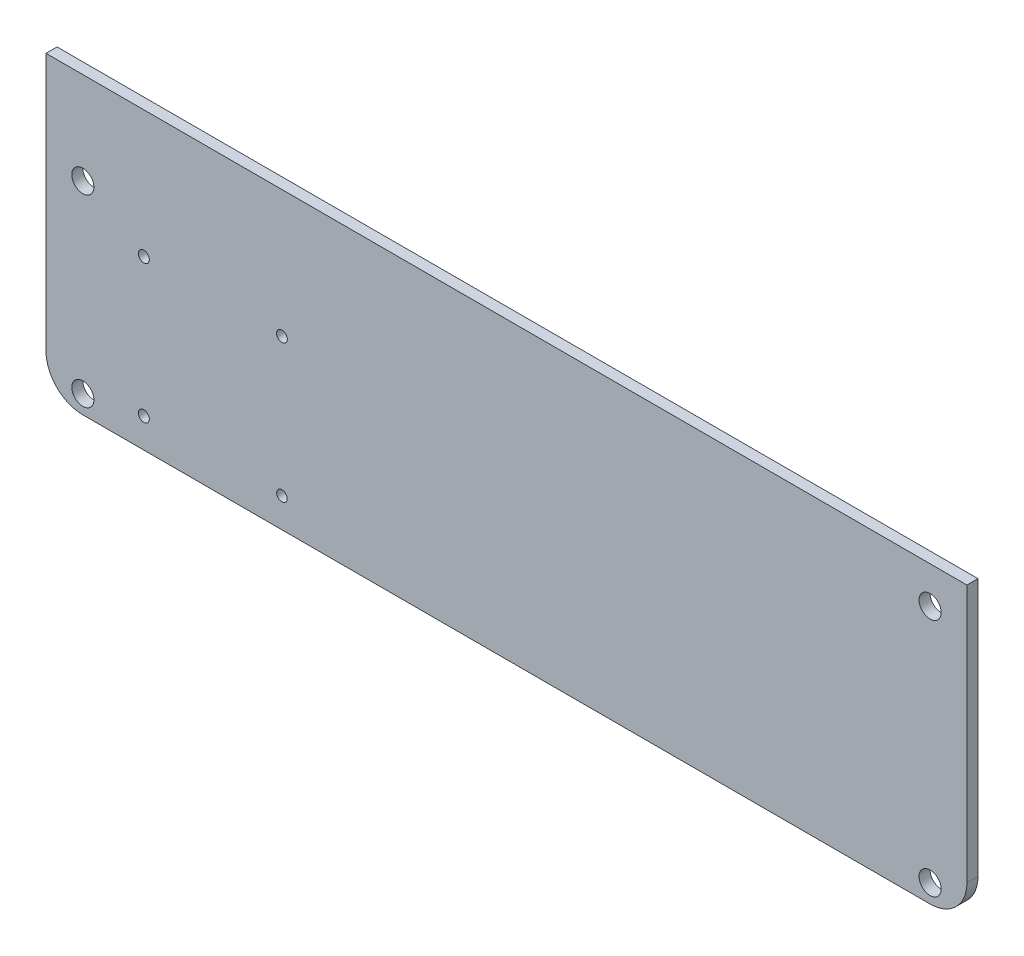
ISO-10303-21;
HEADER;
FILE_DESCRIPTION(('STEP AP214'),'2;1');
FILE_NAME('part.step','',(''),(''),'','','');
FILE_SCHEMA(('AUTOMOTIVE_DESIGN { 1 0 10303 214 1 1 1 1 }'));
ENDSEC;
DATA;
#1=APPLICATION_CONTEXT('core data for automotive mechanical design processes');
#2=APPLICATION_PROTOCOL_DEFINITION('international standard','automotive_design',2000,#1);
#3=PRODUCT_CONTEXT('',#1,'mechanical');
#4=PRODUCT('Part','Part','',(#3));
#5=PRODUCT_RELATED_PRODUCT_CATEGORY('part','',(#4));
#6=PRODUCT_DEFINITION_FORMATION('','',#4);
#7=PRODUCT_DEFINITION_CONTEXT('part definition',#1,'design');
#8=PRODUCT_DEFINITION('design','',#6,#7);
#9=PRODUCT_DEFINITION_SHAPE('','',#8);
#10=(LENGTH_UNIT() NAMED_UNIT(*) SI_UNIT(.MILLI.,.METRE.));
#11=(NAMED_UNIT(*) PLANE_ANGLE_UNIT() SI_UNIT($,.RADIAN.));
#12=(NAMED_UNIT(*) SI_UNIT($,.STERADIAN.) SOLID_ANGLE_UNIT());
#13=UNCERTAINTY_MEASURE_WITH_UNIT(LENGTH_MEASURE(1.E-05),#10,'distance_accuracy_value','');
#14=(GEOMETRIC_REPRESENTATION_CONTEXT(3) GLOBAL_UNCERTAINTY_ASSIGNED_CONTEXT((#13)) GLOBAL_UNIT_ASSIGNED_CONTEXT((#10,
#11,#12)) REPRESENTATION_CONTEXT('',''));
#15=CARTESIAN_POINT('',(0.,0.,0.));
#16=DIRECTION('',(0.,0.,1.));
#17=DIRECTION('',(1.,0.,0.));
#18=AXIS2_PLACEMENT_3D('',#15,#16,#17);
#19=CARTESIAN_POINT('',(0.,0.,3.));
#20=DIRECTION('',(1.,0.,0.));
#21=DIRECTION('',(0.,1.,0.));
#22=AXIS2_PLACEMENT_3D('',#19,#20,#21);
#23=PLANE('',#22);
#24=DIRECTION('',(0.,-1.,0.));
#25=VECTOR('',#24,1.);
#26=CARTESIAN_POINT('',(0.,0.,0.));
#27=LINE('',#26,#25);
#28=CARTESIAN_POINT('',(0.,0.,0.));
#29=VERTEX_POINT('',#28);
#30=CARTESIAN_POINT('',(0.,-69.9999999999999,0.));
#31=VERTEX_POINT('',#30);
#32=EDGE_CURVE('E119',#29,#31,#27,.T.);
#33=ORIENTED_EDGE('',*,*,#32,.T.);
#34=DIRECTION('',(0.,0.,-1.));
#35=VECTOR('',#34,1.);
#36=CARTESIAN_POINT('',(0.,-69.9999999999999,3.));
#37=LINE('',#36,#35);
#38=CARTESIAN_POINT('',(0.,-69.9999999999999,3.));
#39=VERTEX_POINT('',#38);
#40=EDGE_CURVE('E11',#39,#31,#37,.T.);
#41=ORIENTED_EDGE('',*,*,#40,.F.);
#42=DIRECTION('',(0.,-1.,0.));
#43=VECTOR('',#42,1.);
#44=CARTESIAN_POINT('',(0.,0.,3.));
#45=LINE('',#44,#43);
#46=CARTESIAN_POINT('',(0.,0.,3.));
#47=VERTEX_POINT('',#46);
#48=EDGE_CURVE('E130',#47,#39,#45,.T.);
#49=ORIENTED_EDGE('',*,*,#48,.F.);
#50=DIRECTION('',(0.,0.,-1.));
#51=VECTOR('',#50,1.);
#52=CARTESIAN_POINT('',(0.,0.,3.));
#53=LINE('',#52,#51);
#54=EDGE_CURVE('E115',#47,#29,#53,.T.);
#55=ORIENTED_EDGE('',*,*,#54,.T.);
#56=EDGE_LOOP('',(#33,#41,#49,#55));
#57=FACE_BOUND('',#56,.T.);
#58=ADVANCED_FACE('F33',(#57),#23,.F.);
#59=CARTESIAN_POINT('',(10.,-70.,3.));
#60=DIRECTION('',(0.,0.,-1.));
#61=DIRECTION('',(-1.,0.,0.));
#62=AXIS2_PLACEMENT_3D('',#59,#60,#61);
#63=CYLINDRICAL_SURFACE('',#62,10.);
#64=CARTESIAN_POINT('',(10.,-70.,0.));
#65=DIRECTION('',(0.,0.,1.));
#66=DIRECTION('',(1.,0.,0.));
#67=AXIS2_PLACEMENT_3D('',#64,#65,#66);
#68=CIRCLE('',#67,10.);
#69=CARTESIAN_POINT('',(10.0000000000001,-80.,0.));
#70=VERTEX_POINT('',#69);
#71=EDGE_CURVE('E122',#31,#70,#68,.T.);
#72=ORIENTED_EDGE('',*,*,#71,.T.);
#73=DIRECTION('',(0.,0.,-1.));
#74=VECTOR('',#73,1.);
#75=CARTESIAN_POINT('',(10.0000000000001,-80.,3.));
#76=LINE('',#75,#74);
#77=CARTESIAN_POINT('',(10.0000000000001,-80.,3.));
#78=VERTEX_POINT('',#77);
#79=EDGE_CURVE('E42',#78,#70,#76,.T.);
#80=ORIENTED_EDGE('',*,*,#79,.F.);
#81=CARTESIAN_POINT('',(10.,-70.,3.));
#82=DIRECTION('',(0.,0.,1.));
#83=DIRECTION('',(1.,0.,0.));
#84=AXIS2_PLACEMENT_3D('',#81,#82,#83);
#85=CIRCLE('',#84,10.);
#86=EDGE_CURVE('E88',#39,#78,#85,.T.);
#87=ORIENTED_EDGE('',*,*,#86,.F.);
#88=ORIENTED_EDGE('',*,*,#40,.T.);
#89=EDGE_LOOP('',(#72,#80,#87,#88));
#90=FACE_BOUND('',#89,.T.);
#91=ADVANCED_FACE('F169',(#90),#63,.T.);
#92=CARTESIAN_POINT('',(10.0000000000001,-80.,3.));
#93=DIRECTION('',(0.,1.,0.));
#94=DIRECTION('',(0.,0.,1.));
#95=AXIS2_PLACEMENT_3D('',#92,#93,#94);
#96=PLANE('',#95);
#97=DIRECTION('',(1.,0.,0.));
#98=VECTOR('',#97,1.);
#99=CARTESIAN_POINT('',(10.0000000000001,-80.,0.));
#100=LINE('',#99,#98);
#101=CARTESIAN_POINT('',(240.,-80.,0.));
#102=VERTEX_POINT('',#101);
#103=EDGE_CURVE('E125',#70,#102,#100,.T.);
#104=ORIENTED_EDGE('',*,*,#103,.T.);
#105=DIRECTION('',(0.,0.,-1.));
#106=VECTOR('',#105,1.);
#107=CARTESIAN_POINT('',(240.,-80.,3.));
#108=LINE('',#107,#106);
#109=CARTESIAN_POINT('',(240.,-80.,3.));
#110=VERTEX_POINT('',#109);
#111=EDGE_CURVE('E110',#110,#102,#108,.T.);
#112=ORIENTED_EDGE('',*,*,#111,.F.);
#113=DIRECTION('',(1.,0.,0.));
#114=VECTOR('',#113,1.);
#115=CARTESIAN_POINT('',(10.0000000000001,-80.,3.));
#116=LINE('',#115,#114);
#117=EDGE_CURVE('E101',#78,#110,#116,.T.);
#118=ORIENTED_EDGE('',*,*,#117,.F.);
#119=ORIENTED_EDGE('',*,*,#79,.T.);
#120=EDGE_LOOP('',(#104,#112,#118,#119));
#121=FACE_BOUND('',#120,.T.);
#122=ADVANCED_FACE('F172',(#121),#96,.F.);
#123=CARTESIAN_POINT('',(240.,-70.,3.));
#124=DIRECTION('',(0.,0.,-1.));
#125=DIRECTION('',(-1.,0.,0.));
#126=AXIS2_PLACEMENT_3D('',#123,#124,#125);
#127=CYLINDRICAL_SURFACE('',#126,10.);
#128=CARTESIAN_POINT('',(240.,-70.,0.));
#129=DIRECTION('',(0.,0.,1.));
#130=DIRECTION('',(-1.,0.,0.));
#131=AXIS2_PLACEMENT_3D('',#128,#129,#130);
#132=CIRCLE('',#131,10.);
#133=CARTESIAN_POINT('',(250.,-70.,0.));
#134=VERTEX_POINT('',#133);
#135=EDGE_CURVE('E109',#102,#134,#132,.T.);
#136=ORIENTED_EDGE('',*,*,#135,.T.);
#137=DIRECTION('',(0.,0.,-1.));
#138=VECTOR('',#137,1.);
#139=CARTESIAN_POINT('',(250.,-70.,3.));
#140=LINE('',#139,#138);
#141=CARTESIAN_POINT('',(250.,-70.,3.));
#142=VERTEX_POINT('',#141);
#143=EDGE_CURVE('E106',#142,#134,#140,.T.);
#144=ORIENTED_EDGE('',*,*,#143,.F.);
#145=CARTESIAN_POINT('',(240.,-70.,3.));
#146=DIRECTION('',(0.,0.,1.));
#147=DIRECTION('',(-1.,0.,0.));
#148=AXIS2_PLACEMENT_3D('',#145,#146,#147);
#149=CIRCLE('',#148,10.);
#150=EDGE_CURVE('E95',#110,#142,#149,.T.);
#151=ORIENTED_EDGE('',*,*,#150,.F.);
#152=ORIENTED_EDGE('',*,*,#111,.T.);
#153=EDGE_LOOP('',(#136,#144,#151,#152));
#154=FACE_BOUND('',#153,.T.);
#155=ADVANCED_FACE('F107',(#154),#127,.T.);
#156=CARTESIAN_POINT('',(250.,0.,3.));
#157=DIRECTION('',(-1.,0.,0.));
#158=DIRECTION('',(0.,0.,1.));
#159=AXIS2_PLACEMENT_3D('',#156,#157,#158);
#160=PLANE('',#159);
#161=DIRECTION('',(0.,1.,0.));
#162=VECTOR('',#161,1.);
#163=CARTESIAN_POINT('',(250.,0.,0.));
#164=LINE('',#163,#162);
#165=CARTESIAN_POINT('',(250.,0.,0.));
#166=VERTEX_POINT('',#165);
#167=EDGE_CURVE('E74',#134,#166,#164,.T.);
#168=ORIENTED_EDGE('',*,*,#167,.T.);
#169=DIRECTION('',(0.,0.,-1.));
#170=VECTOR('',#169,1.);
#171=CARTESIAN_POINT('',(250.,0.,3.));
#172=LINE('',#171,#170);
#173=CARTESIAN_POINT('',(250.,0.,3.));
#174=VERTEX_POINT('',#173);
#175=EDGE_CURVE('E111',#174,#166,#172,.T.);
#176=ORIENTED_EDGE('',*,*,#175,.F.);
#177=DIRECTION('',(0.,1.,0.));
#178=VECTOR('',#177,1.);
#179=CARTESIAN_POINT('',(250.,0.,3.));
#180=LINE('',#179,#178);
#181=EDGE_CURVE('E99',#142,#174,#180,.T.);
#182=ORIENTED_EDGE('',*,*,#181,.F.);
#183=ORIENTED_EDGE('',*,*,#143,.T.);
#184=EDGE_LOOP('',(#168,#176,#182,#183));
#185=FACE_BOUND('',#184,.T.);
#186=ADVANCED_FACE('F113',(#185),#160,.F.);
#187=CARTESIAN_POINT('',(0.,0.,3.));
#188=DIRECTION('',(0.,-1.,0.));
#189=DIRECTION('',(0.,0.,-1.));
#190=AXIS2_PLACEMENT_3D('',#187,#188,#189);
#191=PLANE('',#190);
#192=DIRECTION('',(-1.,0.,0.));
#193=VECTOR('',#192,1.);
#194=CARTESIAN_POINT('',(0.,0.,0.));
#195=LINE('',#194,#193);
#196=EDGE_CURVE('E80',#166,#29,#195,.T.);
#197=ORIENTED_EDGE('',*,*,#196,.T.);
#198=ORIENTED_EDGE('',*,*,#54,.F.);
#199=DIRECTION('',(-1.,0.,0.));
#200=VECTOR('',#199,1.);
#201=CARTESIAN_POINT('',(0.,0.,3.));
#202=LINE('',#201,#200);
#203=EDGE_CURVE('E51',#174,#47,#202,.T.);
#204=ORIENTED_EDGE('',*,*,#203,.F.);
#205=ORIENTED_EDGE('',*,*,#175,.T.);
#206=EDGE_LOOP('',(#197,#198,#204,#205));
#207=FACE_BOUND('',#206,.T.);
#208=ADVANCED_FACE('F177',(#207),#191,.F.);
#209=CARTESIAN_POINT('',(10.,-70.,3.));
#210=DIRECTION('',(0.,0.,1.));
#211=DIRECTION('',(1.,0.,0.));
#212=AXIS2_PLACEMENT_3D('',#209,#210,#211);
#213=PLANE('',#212);
#214=CARTESIAN_POINT('',(26.5494269665201,-72.,3.));
#215=DIRECTION('',(0.,0.,1.));
#216=DIRECTION('',(1.,0.,0.));
#217=AXIS2_PLACEMENT_3D('',#214,#215,#216);
#218=CIRCLE('',#217,1.50000000000002);
#219=CARTESIAN_POINT('',(28.0494269665201,-72.,3.));
#220=VERTEX_POINT('',#219);
#221=EDGE_CURVE('E310',#220,#220,#218,.T.);
#222=ORIENTED_EDGE('',*,*,#221,.F.);
#223=EDGE_LOOP('',(#222));
#224=FACE_BOUND('',#223,.T.);
#225=CARTESIAN_POINT('',(64.0494269665201,-72.,3.));
#226=DIRECTION('',(0.,0.,1.));
#227=DIRECTION('',(1.,0.,0.));
#228=AXIS2_PLACEMENT_3D('',#225,#226,#227);
#229=CIRCLE('',#228,1.42518172751655);
#230=CARTESIAN_POINT('',(65.4746086940366,-72.,3.));
#231=VERTEX_POINT('',#230);
#232=EDGE_CURVE('E311',#231,#231,#229,.T.);
#233=ORIENTED_EDGE('',*,*,#232,.F.);
#234=EDGE_LOOP('',(#233));
#235=FACE_BOUND('',#234,.T.);
#236=CARTESIAN_POINT('',(64.0494269665201,-34.5,3.));
#237=DIRECTION('',(0.,0.,1.));
#238=DIRECTION('',(1.,0.,0.));
#239=AXIS2_PLACEMENT_3D('',#236,#237,#238);
#240=CIRCLE('',#239,1.45674506388639);
#241=CARTESIAN_POINT('',(65.5061720304065,-34.5,3.));
#242=VERTEX_POINT('',#241);
#243=EDGE_CURVE('E314',#242,#242,#240,.T.);
#244=ORIENTED_EDGE('',*,*,#243,.F.);
#245=EDGE_LOOP('',(#244));
#246=FACE_BOUND('',#245,.T.);
#247=CARTESIAN_POINT('',(26.5494269665201,-34.5,3.));
#248=DIRECTION('',(0.,0.,1.));
#249=DIRECTION('',(1.,0.,0.));
#250=AXIS2_PLACEMENT_3D('',#247,#248,#249);
#251=CIRCLE('',#250,1.50000000000002);
#252=CARTESIAN_POINT('',(28.0494269665201,-34.5,3.));
#253=VERTEX_POINT('',#252);
#254=EDGE_CURVE('E140',#253,#253,#251,.T.);
#255=ORIENTED_EDGE('',*,*,#254,.F.);
#256=EDGE_LOOP('',(#255));
#257=FACE_BOUND('',#256,.T.);
#258=CARTESIAN_POINT('',(10.,-25.,3.));
#259=DIRECTION('',(0.,0.,1.));
#260=DIRECTION('',(1.,0.,0.));
#261=AXIS2_PLACEMENT_3D('',#258,#259,#260);
#262=CIRCLE('',#261,3.);
#263=CARTESIAN_POINT('',(13.,-25.,3.));
#264=VERTEX_POINT('',#263);
#265=EDGE_CURVE('E147',#264,#264,#262,.T.);
#266=ORIENTED_EDGE('',*,*,#265,.F.);
#267=EDGE_LOOP('',(#266));
#268=FACE_BOUND('',#267,.T.);
#269=CARTESIAN_POINT('',(240.,-9.99999999999999,3.));
#270=DIRECTION('',(0.,0.,1.));
#271=DIRECTION('',(1.,0.,0.));
#272=AXIS2_PLACEMENT_3D('',#269,#270,#271);
#273=CIRCLE('',#272,2.99999999999999);
#274=CARTESIAN_POINT('',(243.,-9.99999999999999,3.));
#275=VERTEX_POINT('',#274);
#276=EDGE_CURVE('E156',#275,#275,#273,.T.);
#277=ORIENTED_EDGE('',*,*,#276,.F.);
#278=EDGE_LOOP('',(#277));
#279=FACE_BOUND('',#278,.T.);
#280=CARTESIAN_POINT('',(240.,-75.,3.));
#281=DIRECTION('',(0.,0.,1.));
#282=DIRECTION('',(1.,0.,0.));
#283=AXIS2_PLACEMENT_3D('',#280,#281,#282);
#284=CIRCLE('',#283,2.99999999999999);
#285=CARTESIAN_POINT('',(243.,-75.,3.));
#286=VERTEX_POINT('',#285);
#287=EDGE_CURVE('E322',#286,#286,#284,.T.);
#288=ORIENTED_EDGE('',*,*,#287,.F.);
#289=EDGE_LOOP('',(#288));
#290=FACE_BOUND('',#289,.T.);
#291=CARTESIAN_POINT('',(10.,-75.,3.));
#292=DIRECTION('',(0.,0.,1.));
#293=DIRECTION('',(1.,0.,0.));
#294=AXIS2_PLACEMENT_3D('',#291,#292,#293);
#295=CIRCLE('',#294,3.);
#296=CARTESIAN_POINT('',(13.,-75.,3.));
#297=VERTEX_POINT('',#296);
#298=EDGE_CURVE('E162',#297,#297,#295,.T.);
#299=ORIENTED_EDGE('',*,*,#298,.F.);
#300=EDGE_LOOP('',(#299));
#301=FACE_BOUND('',#300,.T.);
#302=ORIENTED_EDGE('',*,*,#48,.T.);
#303=ORIENTED_EDGE('',*,*,#86,.T.);
#304=ORIENTED_EDGE('',*,*,#117,.T.);
#305=ORIENTED_EDGE('',*,*,#150,.T.);
#306=ORIENTED_EDGE('',*,*,#181,.T.);
#307=ORIENTED_EDGE('',*,*,#203,.T.);
#308=EDGE_LOOP('',(#302,#303,#304,#305,#306,#307));
#309=FACE_BOUND('',#308,.T.);
#310=ADVANCED_FACE('F97',(#224,#235,#246,#257,#268,#279,#290,#301,#309),#213,.T.);
#311=CARTESIAN_POINT('',(10.,-70.,0.));
#312=DIRECTION('',(0.,0.,1.));
#313=DIRECTION('',(1.,0.,0.));
#314=AXIS2_PLACEMENT_3D('',#311,#312,#313);
#315=PLANE('',#314);
#316=CARTESIAN_POINT('',(26.5494269665201,-72.,0.));
#317=DIRECTION('',(0.,0.,1.));
#318=DIRECTION('',(1.,0.,0.));
#319=AXIS2_PLACEMENT_3D('',#316,#317,#318);
#320=CIRCLE('',#319,1.50000000000002);
#321=CARTESIAN_POINT('',(28.0494269665201,-72.,0.));
#322=VERTEX_POINT('',#321);
#323=EDGE_CURVE('E36',#322,#322,#320,.T.);
#324=ORIENTED_EDGE('',*,*,#323,.T.);
#325=EDGE_LOOP('',(#324));
#326=FACE_BOUND('',#325,.T.);
#327=CARTESIAN_POINT('',(64.0494269665201,-72.,0.));
#328=DIRECTION('',(0.,0.,1.));
#329=DIRECTION('',(1.,0.,0.));
#330=AXIS2_PLACEMENT_3D('',#327,#328,#329);
#331=CIRCLE('',#330,1.42518172751655);
#332=CARTESIAN_POINT('',(65.4746086940366,-72.,0.));
#333=VERTEX_POINT('',#332);
#334=EDGE_CURVE('E142',#333,#333,#331,.T.);
#335=ORIENTED_EDGE('',*,*,#334,.T.);
#336=EDGE_LOOP('',(#335));
#337=FACE_BOUND('',#336,.T.);
#338=CARTESIAN_POINT('',(64.0494269665201,-34.5,0.));
#339=DIRECTION('',(0.,0.,1.));
#340=DIRECTION('',(1.,0.,0.));
#341=AXIS2_PLACEMENT_3D('',#338,#339,#340);
#342=CIRCLE('',#341,1.45674506388639);
#343=CARTESIAN_POINT('',(65.5061720304065,-34.5,0.));
#344=VERTEX_POINT('',#343);
#345=EDGE_CURVE('E139',#344,#344,#342,.T.);
#346=ORIENTED_EDGE('',*,*,#345,.T.);
#347=EDGE_LOOP('',(#346));
#348=FACE_BOUND('',#347,.T.);
#349=CARTESIAN_POINT('',(26.5494269665201,-34.5,0.));
#350=DIRECTION('',(0.,0.,1.));
#351=DIRECTION('',(1.,0.,0.));
#352=AXIS2_PLACEMENT_3D('',#349,#350,#351);
#353=CIRCLE('',#352,1.50000000000002);
#354=CARTESIAN_POINT('',(28.0494269665201,-34.5,0.));
#355=VERTEX_POINT('',#354);
#356=EDGE_CURVE('E136',#355,#355,#353,.T.);
#357=ORIENTED_EDGE('',*,*,#356,.T.);
#358=EDGE_LOOP('',(#357));
#359=FACE_BOUND('',#358,.T.);
#360=CARTESIAN_POINT('',(10.,-25.,0.));
#361=DIRECTION('',(0.,0.,1.));
#362=DIRECTION('',(1.,0.,0.));
#363=AXIS2_PLACEMENT_3D('',#360,#361,#362);
#364=CIRCLE('',#363,3.);
#365=CARTESIAN_POINT('',(13.,-25.,0.));
#366=VERTEX_POINT('',#365);
#367=EDGE_CURVE('E151',#366,#366,#364,.T.);
#368=ORIENTED_EDGE('',*,*,#367,.T.);
#369=EDGE_LOOP('',(#368));
#370=FACE_BOUND('',#369,.T.);
#371=CARTESIAN_POINT('',(240.,-9.99999999999999,0.));
#372=DIRECTION('',(0.,0.,1.));
#373=DIRECTION('',(1.,0.,0.));
#374=AXIS2_PLACEMENT_3D('',#371,#372,#373);
#375=CIRCLE('',#374,2.99999999999999);
#376=CARTESIAN_POINT('',(243.,-9.99999999999999,0.));
#377=VERTEX_POINT('',#376);
#378=EDGE_CURVE('E325',#377,#377,#375,.T.);
#379=ORIENTED_EDGE('',*,*,#378,.T.);
#380=EDGE_LOOP('',(#379));
#381=FACE_BOUND('',#380,.T.);
#382=CARTESIAN_POINT('',(240.,-75.,0.));
#383=DIRECTION('',(0.,0.,1.));
#384=DIRECTION('',(1.,0.,0.));
#385=AXIS2_PLACEMENT_3D('',#382,#383,#384);
#386=CIRCLE('',#385,2.99999999999999);
#387=CARTESIAN_POINT('',(243.,-75.,0.));
#388=VERTEX_POINT('',#387);
#389=EDGE_CURVE('E165',#388,#388,#386,.T.);
#390=ORIENTED_EDGE('',*,*,#389,.T.);
#391=EDGE_LOOP('',(#390));
#392=FACE_BOUND('',#391,.T.);
#393=CARTESIAN_POINT('',(10.,-75.,0.));
#394=DIRECTION('',(0.,0.,1.));
#395=DIRECTION('',(1.,0.,0.));
#396=AXIS2_PLACEMENT_3D('',#393,#394,#395);
#397=CIRCLE('',#396,3.);
#398=CARTESIAN_POINT('',(13.,-75.,0.));
#399=VERTEX_POINT('',#398);
#400=EDGE_CURVE('E123',#399,#399,#397,.T.);
#401=ORIENTED_EDGE('',*,*,#400,.T.);
#402=EDGE_LOOP('',(#401));
#403=FACE_BOUND('',#402,.T.);
#404=ORIENTED_EDGE('',*,*,#32,.F.);
#405=ORIENTED_EDGE('',*,*,#196,.F.);
#406=ORIENTED_EDGE('',*,*,#167,.F.);
#407=ORIENTED_EDGE('',*,*,#135,.F.);
#408=ORIENTED_EDGE('',*,*,#103,.F.);
#409=ORIENTED_EDGE('',*,*,#71,.F.);
#410=EDGE_LOOP('',(#404,#405,#406,#407,#408,#409));
#411=FACE_BOUND('',#410,.T.);
#412=ADVANCED_FACE('F175',(#326,#337,#348,#359,#370,#381,#392,#403,#411),#315,.F.);
#413=CARTESIAN_POINT('',(10.,-75.,0.));
#414=DIRECTION('',(0.,0.,1.));
#415=DIRECTION('',(1.,0.,0.));
#416=AXIS2_PLACEMENT_3D('',#413,#414,#415);
#417=CYLINDRICAL_SURFACE('',#416,3.);
#418=ORIENTED_EDGE('',*,*,#400,.F.);
#419=EDGE_LOOP('',(#418));
#420=FACE_BOUND('',#419,.T.);
#421=ORIENTED_EDGE('',*,*,#298,.T.);
#422=EDGE_LOOP('',(#421));
#423=FACE_BOUND('',#422,.T.);
#424=ADVANCED_FACE('F216',(#420,#423),#417,.F.);
#425=CARTESIAN_POINT('',(240.,-75.,0.));
#426=DIRECTION('',(0.,0.,1.));
#427=DIRECTION('',(1.,0.,0.));
#428=AXIS2_PLACEMENT_3D('',#425,#426,#427);
#429=CYLINDRICAL_SURFACE('',#428,2.99999999999999);
#430=ORIENTED_EDGE('',*,*,#389,.F.);
#431=EDGE_LOOP('',(#430));
#432=FACE_BOUND('',#431,.T.);
#433=ORIENTED_EDGE('',*,*,#287,.T.);
#434=EDGE_LOOP('',(#433));
#435=FACE_BOUND('',#434,.T.);
#436=ADVANCED_FACE('F221',(#432,#435),#429,.F.);
#437=CARTESIAN_POINT('',(240.,-9.99999999999999,0.));
#438=DIRECTION('',(0.,0.,1.));
#439=DIRECTION('',(1.,0.,0.));
#440=AXIS2_PLACEMENT_3D('',#437,#438,#439);
#441=CYLINDRICAL_SURFACE('',#440,2.99999999999999);
#442=ORIENTED_EDGE('',*,*,#378,.F.);
#443=EDGE_LOOP('',(#442));
#444=FACE_BOUND('',#443,.T.);
#445=ORIENTED_EDGE('',*,*,#276,.T.);
#446=EDGE_LOOP('',(#445));
#447=FACE_BOUND('',#446,.T.);
#448=ADVANCED_FACE('F233',(#444,#447),#441,.F.);
#449=CARTESIAN_POINT('',(10.,-25.,0.));
#450=DIRECTION('',(0.,0.,1.));
#451=DIRECTION('',(1.,0.,0.));
#452=AXIS2_PLACEMENT_3D('',#449,#450,#451);
#453=CYLINDRICAL_SURFACE('',#452,3.);
#454=ORIENTED_EDGE('',*,*,#367,.F.);
#455=EDGE_LOOP('',(#454));
#456=FACE_BOUND('',#455,.T.);
#457=ORIENTED_EDGE('',*,*,#265,.T.);
#458=EDGE_LOOP('',(#457));
#459=FACE_BOUND('',#458,.T.);
#460=ADVANCED_FACE('F243',(#456,#459),#453,.F.);
#461=CARTESIAN_POINT('',(26.5494269665201,-34.5,-7.));
#462=DIRECTION('',(0.,0.,1.));
#463=DIRECTION('',(1.,0.,0.));
#464=AXIS2_PLACEMENT_3D('',#461,#462,#463);
#465=CYLINDRICAL_SURFACE('',#464,1.50000000000002);
#466=ORIENTED_EDGE('',*,*,#254,.T.);
#467=EDGE_LOOP('',(#466));
#468=FACE_BOUND('',#467,.T.);
#469=ORIENTED_EDGE('',*,*,#356,.F.);
#470=EDGE_LOOP('',(#469));
#471=FACE_BOUND('',#470,.T.);
#472=ADVANCED_FACE('F253',(#468,#471),#465,.F.);
#473=CARTESIAN_POINT('',(64.0494269665201,-34.5,-7.));
#474=DIRECTION('',(0.,0.,1.));
#475=DIRECTION('',(1.,0.,0.));
#476=AXIS2_PLACEMENT_3D('',#473,#474,#475);
#477=CYLINDRICAL_SURFACE('',#476,1.45674506388639);
#478=ORIENTED_EDGE('',*,*,#243,.T.);
#479=EDGE_LOOP('',(#478));
#480=FACE_BOUND('',#479,.T.);
#481=ORIENTED_EDGE('',*,*,#345,.F.);
#482=EDGE_LOOP('',(#481));
#483=FACE_BOUND('',#482,.T.);
#484=ADVANCED_FACE('F273',(#480,#483),#477,.F.);
#485=CARTESIAN_POINT('',(64.0494269665201,-72.,-7.));
#486=DIRECTION('',(0.,0.,1.));
#487=DIRECTION('',(1.,0.,0.));
#488=AXIS2_PLACEMENT_3D('',#485,#486,#487);
#489=CYLINDRICAL_SURFACE('',#488,1.42518172751655);
#490=ORIENTED_EDGE('',*,*,#232,.T.);
#491=EDGE_LOOP('',(#490));
#492=FACE_BOUND('',#491,.T.);
#493=ORIENTED_EDGE('',*,*,#334,.F.);
#494=EDGE_LOOP('',(#493));
#495=FACE_BOUND('',#494,.T.);
#496=ADVANCED_FACE('F283',(#492,#495),#489,.F.);
#497=CARTESIAN_POINT('',(26.5494269665201,-72.,-7.));
#498=DIRECTION('',(0.,0.,1.));
#499=DIRECTION('',(1.,0.,0.));
#500=AXIS2_PLACEMENT_3D('',#497,#498,#499);
#501=CYLINDRICAL_SURFACE('',#500,1.50000000000002);
#502=ORIENTED_EDGE('',*,*,#221,.T.);
#503=EDGE_LOOP('',(#502));
#504=FACE_BOUND('',#503,.T.);
#505=ORIENTED_EDGE('',*,*,#323,.F.);
#506=EDGE_LOOP('',(#505));
#507=FACE_BOUND('',#506,.T.);
#508=ADVANCED_FACE('F293',(#504,#507),#501,.F.);
#509=CLOSED_SHELL('',(#58,#91,#122,#155,#186,#208,#310,#412,#424,#436,#448,#460,#472,#484,#496,#508));
#510=MANIFOLD_SOLID_BREP('B2',#509);
#511=ADVANCED_BREP_SHAPE_REPRESENTATION('',(#18,#510),#14);
#512=SHAPE_DEFINITION_REPRESENTATION(#9,#511);
ENDSEC;
END-ISO-10303-21;
